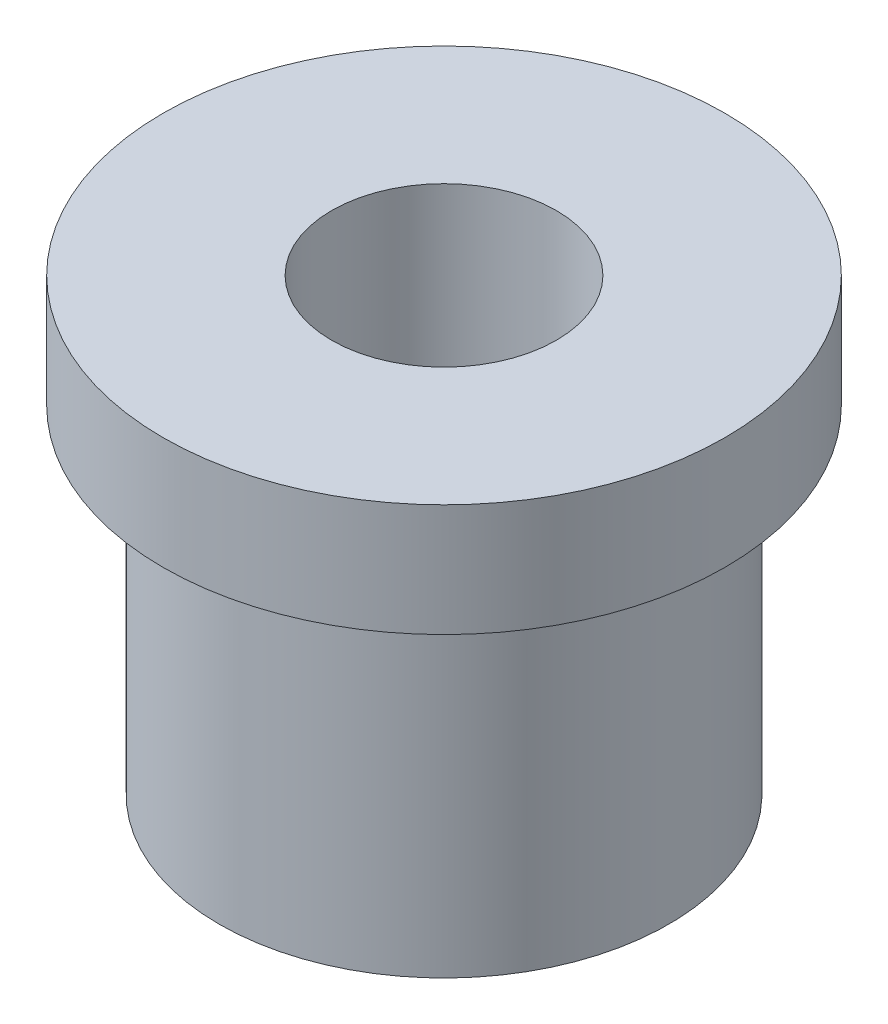
ISO-10303-21;
HEADER;
FILE_DESCRIPTION(('STEP AP214'),'2;1');
FILE_NAME('part.step','',(''),(''),'','','');
FILE_SCHEMA(('AUTOMOTIVE_DESIGN { 1 0 10303 214 1 1 1 1 }'));
ENDSEC;
DATA;
#1=APPLICATION_CONTEXT('core data for automotive mechanical design processes');
#2=APPLICATION_PROTOCOL_DEFINITION('international standard','automotive_design',2000,#1);
#3=PRODUCT_CONTEXT('',#1,'mechanical');
#4=PRODUCT('Part','Part','',(#3));
#5=PRODUCT_RELATED_PRODUCT_CATEGORY('part','',(#4));
#6=PRODUCT_DEFINITION_FORMATION('','',#4);
#7=PRODUCT_DEFINITION_CONTEXT('part definition',#1,'design');
#8=PRODUCT_DEFINITION('design','',#6,#7);
#9=PRODUCT_DEFINITION_SHAPE('','',#8);
#10=(LENGTH_UNIT() NAMED_UNIT(*) SI_UNIT(.MILLI.,.METRE.));
#11=(NAMED_UNIT(*) PLANE_ANGLE_UNIT() SI_UNIT($,.RADIAN.));
#12=(NAMED_UNIT(*) SI_UNIT($,.STERADIAN.) SOLID_ANGLE_UNIT());
#13=UNCERTAINTY_MEASURE_WITH_UNIT(LENGTH_MEASURE(1.E-05),#10,'distance_accuracy_value','');
#14=(GEOMETRIC_REPRESENTATION_CONTEXT(3) GLOBAL_UNCERTAINTY_ASSIGNED_CONTEXT((#13)) GLOBAL_UNIT_ASSIGNED_CONTEXT((#10,
#11,#12)) REPRESENTATION_CONTEXT('',''));
#15=CARTESIAN_POINT('',(0.,0.,0.));
#16=DIRECTION('',(0.,0.,1.));
#17=DIRECTION('',(1.,0.,0.));
#18=AXIS2_PLACEMENT_3D('',#15,#16,#17);
#19=CARTESIAN_POINT('',(0.,0.,0.));
#20=DIRECTION('',(0.,1.,0.));
#21=DIRECTION('',(0.,0.,1.));
#22=AXIS2_PLACEMENT_3D('',#19,#20,#21);
#23=PLANE('',#22);
#24=CARTESIAN_POINT('',(0.,0.,0.));
#25=DIRECTION('',(0.,1.,0.));
#26=DIRECTION('',(-1.,0.,0.));
#27=AXIS2_PLACEMENT_3D('',#24,#25,#26);
#28=CIRCLE('',#27,5.);
#29=CARTESIAN_POINT('',(-5.,0.,0.));
#30=VERTEX_POINT('',#29);
#31=EDGE_CURVE('E58',#30,#30,#28,.T.);
#32=ORIENTED_EDGE('',*,*,#31,.F.);
#33=EDGE_LOOP('',(#32));
#34=FACE_BOUND('',#33,.T.);
#35=CARTESIAN_POINT('',(0.,0.,0.));
#36=DIRECTION('',(0.,-1.,0.));
#37=DIRECTION('',(0.,0.,-1.));
#38=AXIS2_PLACEMENT_3D('',#35,#36,#37);
#39=CIRCLE('',#38,12.5);
#40=CARTESIAN_POINT('',(0.,0.,-12.5));
#41=VERTEX_POINT('',#40);
#42=EDGE_CURVE('E10',#41,#41,#39,.T.);
#43=ORIENTED_EDGE('',*,*,#42,.F.);
#44=EDGE_LOOP('',(#43));
#45=FACE_BOUND('',#44,.T.);
#46=ADVANCED_FACE('F39',(#34,#45),#23,.T.);
#47=CARTESIAN_POINT('',(0.,-25.,0.));
#48=DIRECTION('',(0.,-1.,0.));
#49=DIRECTION('',(0.,0.,-1.));
#50=AXIS2_PLACEMENT_3D('',#47,#48,#49);
#51=CYLINDRICAL_SURFACE('',#50,12.5);
#52=ORIENTED_EDGE('',*,*,#42,.T.);
#53=EDGE_LOOP('',(#52));
#54=FACE_BOUND('',#53,.T.);
#55=CARTESIAN_POINT('',(0.,-5.,0.));
#56=DIRECTION('',(0.,-1.,0.));
#57=DIRECTION('',(0.,0.,-1.));
#58=AXIS2_PLACEMENT_3D('',#55,#56,#57);
#59=CIRCLE('',#58,12.5);
#60=CARTESIAN_POINT('',(0.,-5.,-12.5));
#61=VERTEX_POINT('',#60);
#62=EDGE_CURVE('E45',#61,#61,#59,.T.);
#63=ORIENTED_EDGE('',*,*,#62,.F.);
#64=EDGE_LOOP('',(#63));
#65=FACE_BOUND('',#64,.T.);
#66=ADVANCED_FACE('F69',(#54,#65),#51,.T.);
#67=CARTESIAN_POINT('',(12.5,-5.,0.));
#68=DIRECTION('',(0.,-1.,0.));
#69=DIRECTION('',(0.,0.,-1.));
#70=AXIS2_PLACEMENT_3D('',#67,#68,#69);
#71=PLANE('',#70);
#72=ORIENTED_EDGE('',*,*,#62,.T.);
#73=EDGE_LOOP('',(#72));
#74=FACE_BOUND('',#73,.T.);
#75=CARTESIAN_POINT('',(0.,-5.,0.));
#76=DIRECTION('',(0.,-1.,0.));
#77=DIRECTION('',(0.,0.,-1.));
#78=AXIS2_PLACEMENT_3D('',#75,#76,#77);
#79=CIRCLE('',#78,10.);
#80=CARTESIAN_POINT('',(0.,-5.,-10.));
#81=VERTEX_POINT('',#80);
#82=EDGE_CURVE('E49',#81,#81,#79,.T.);
#83=ORIENTED_EDGE('',*,*,#82,.F.);
#84=EDGE_LOOP('',(#83));
#85=FACE_BOUND('',#84,.T.);
#86=ADVANCED_FACE('F75',(#74,#85),#71,.T.);
#87=CARTESIAN_POINT('',(0.,-25.,0.));
#88=DIRECTION('',(0.,-1.,0.));
#89=DIRECTION('',(0.,0.,-1.));
#90=AXIS2_PLACEMENT_3D('',#87,#88,#89);
#91=CYLINDRICAL_SURFACE('',#90,10.);
#92=ORIENTED_EDGE('',*,*,#82,.T.);
#93=EDGE_LOOP('',(#92));
#94=FACE_BOUND('',#93,.T.);
#95=CARTESIAN_POINT('',(0.,-20.,0.));
#96=DIRECTION('',(0.,-1.,0.));
#97=DIRECTION('',(0.,0.,-1.));
#98=AXIS2_PLACEMENT_3D('',#95,#96,#97);
#99=CIRCLE('',#98,10.);
#100=CARTESIAN_POINT('',(0.,-20.,-10.));
#101=VERTEX_POINT('',#100);
#102=EDGE_CURVE('E53',#101,#101,#99,.T.);
#103=ORIENTED_EDGE('',*,*,#102,.F.);
#104=EDGE_LOOP('',(#103));
#105=FACE_BOUND('',#104,.T.);
#106=ADVANCED_FACE('F79',(#94,#105),#91,.T.);
#107=CARTESIAN_POINT('',(10.,-20.,0.));
#108=DIRECTION('',(0.,-1.,0.));
#109=DIRECTION('',(0.,0.,-1.));
#110=AXIS2_PLACEMENT_3D('',#107,#108,#109);
#111=PLANE('',#110);
#112=CARTESIAN_POINT('',(0.,-20.,0.));
#113=DIRECTION('',(0.,-1.,0.));
#114=DIRECTION('',(0.,0.,-1.));
#115=AXIS2_PLACEMENT_3D('',#112,#113,#114);
#116=CIRCLE('',#115,5.);
#117=CARTESIAN_POINT('',(0.,-20.,-5.));
#118=VERTEX_POINT('',#117);
#119=EDGE_CURVE('E59',#118,#118,#116,.F.);
#120=ORIENTED_EDGE('',*,*,#119,.T.);
#121=EDGE_LOOP('',(#120));
#122=FACE_BOUND('',#121,.T.);
#123=ORIENTED_EDGE('',*,*,#102,.T.);
#124=EDGE_LOOP('',(#123));
#125=FACE_BOUND('',#124,.T.);
#126=ADVANCED_FACE('F84',(#122,#125),#111,.T.);
#127=CARTESIAN_POINT('',(0.,-20.001,0.));
#128=DIRECTION('',(0.,1.,0.));
#129=DIRECTION('',(-1.,0.,0.));
#130=AXIS2_PLACEMENT_3D('',#127,#128,#129);
#131=CYLINDRICAL_SURFACE('',#130,5.);
#132=ORIENTED_EDGE('',*,*,#119,.F.);
#133=EDGE_LOOP('',(#132));
#134=FACE_BOUND('',#133,.T.);
#135=ORIENTED_EDGE('',*,*,#31,.T.);
#136=EDGE_LOOP('',(#135));
#137=FACE_BOUND('',#136,.T.);
#138=ADVANCED_FACE('F65',(#134,#137),#131,.F.);
#139=CLOSED_SHELL('',(#46,#66,#86,#106,#126,#138));
#140=MANIFOLD_SOLID_BREP('B2',#139);
#141=ADVANCED_BREP_SHAPE_REPRESENTATION('',(#18,#140),#14);
#142=SHAPE_DEFINITION_REPRESENTATION(#9,#141);
ENDSEC;
END-ISO-10303-21;
